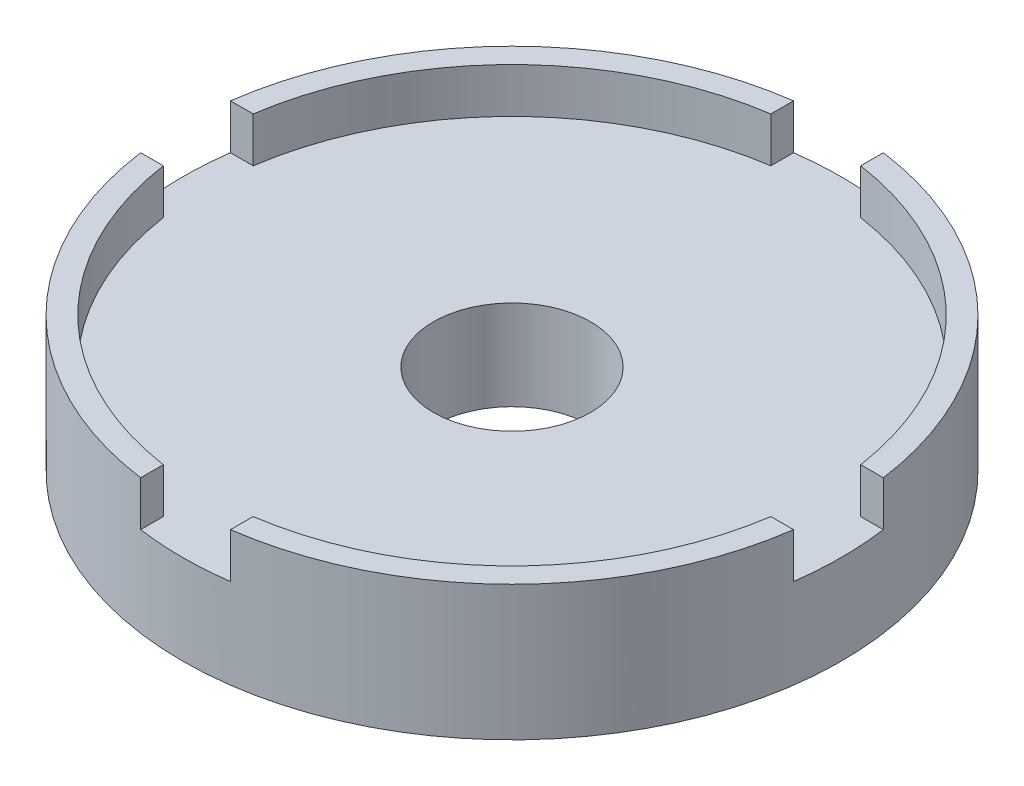
ISO-10303-21;
HEADER;
FILE_DESCRIPTION(('STEP AP214'),'2;1');
FILE_NAME('part.step','',(''),(''),'','','');
FILE_SCHEMA(('AUTOMOTIVE_DESIGN { 1 0 10303 214 1 1 1 1 }'));
ENDSEC;
DATA;
#1=APPLICATION_CONTEXT('core data for automotive mechanical design processes');
#2=APPLICATION_PROTOCOL_DEFINITION('international standard','automotive_design',2000,#1);
#3=PRODUCT_CONTEXT('',#1,'mechanical');
#4=PRODUCT('Part','Part','',(#3));
#5=PRODUCT_RELATED_PRODUCT_CATEGORY('part','',(#4));
#6=PRODUCT_DEFINITION_FORMATION('','',#4);
#7=PRODUCT_DEFINITION_CONTEXT('part definition',#1,'design');
#8=PRODUCT_DEFINITION('design','',#6,#7);
#9=PRODUCT_DEFINITION_SHAPE('','',#8);
#10=(LENGTH_UNIT() NAMED_UNIT(*) SI_UNIT(.MILLI.,.METRE.));
#11=(NAMED_UNIT(*) PLANE_ANGLE_UNIT() SI_UNIT($,.RADIAN.));
#12=(NAMED_UNIT(*) SI_UNIT($,.STERADIAN.) SOLID_ANGLE_UNIT());
#13=UNCERTAINTY_MEASURE_WITH_UNIT(LENGTH_MEASURE(1.E-05),#10,'distance_accuracy_value','');
#14=(GEOMETRIC_REPRESENTATION_CONTEXT(3) GLOBAL_UNCERTAINTY_ASSIGNED_CONTEXT((#13)) GLOBAL_UNIT_ASSIGNED_CONTEXT((#10,
#11,#12)) REPRESENTATION_CONTEXT('',''));
#15=CARTESIAN_POINT('',(0.,0.,0.));
#16=DIRECTION('',(0.,0.,1.));
#17=DIRECTION('',(1.,0.,0.));
#18=AXIS2_PLACEMENT_3D('',#15,#16,#17);
#19=CARTESIAN_POINT('',(4.00228236262587,0.,4.81806655713623));
#20=DIRECTION('',(0.,1.,0.));
#21=DIRECTION('',(0.,0.,1.));
#22=AXIS2_PLACEMENT_3D('',#19,#20,#21);
#23=CYLINDRICAL_SURFACE('',#22,68.353999999999);
#24=CARTESIAN_POINT('',(4.00228236262587,30.,4.81806655713623));
#25=DIRECTION('',(0.,1.,0.));
#26=DIRECTION('',(0.,0.,1.));
#27=AXIS2_PLACEMENT_3D('',#24,#25,#26);
#28=CIRCLE('',#27,68.353999999999);
#29=CARTESIAN_POINT('',(71.6208398450201,30.,-5.18193344286378));
#30=VERTEX_POINT('',#29);
#31=CARTESIAN_POINT('',(14.0022823626258,30.,-62.8004909252581));
#32=VERTEX_POINT('',#31);
#33=EDGE_CURVE('E201',#30,#32,#28,.T.);
#34=ORIENTED_EDGE('',*,*,#33,.T.);
#35=DIRECTION('',(0.,1.,0.));
#36=VECTOR('',#35,1.);
#37=CARTESIAN_POINT('',(14.0022823626258,0.,-62.8004909252581));
#38=LINE('',#37,#36);
#39=CARTESIAN_POINT('',(14.0022823626258,20.,-62.8004909252581));
#40=VERTEX_POINT('',#39);
#41=EDGE_CURVE('E232',#32,#40,#38,.F.);
#42=ORIENTED_EDGE('',*,*,#41,.T.);
#43=CARTESIAN_POINT('',(4.00228236262587,20.,4.81806655713623));
#44=DIRECTION('',(0.,1.,0.));
#45=DIRECTION('',(0.,0.,1.));
#46=AXIS2_PLACEMENT_3D('',#43,#44,#45);
#47=CIRCLE('',#46,68.353999999999);
#48=CARTESIAN_POINT('',(71.6208398450201,20.,-5.18193344286378));
#49=VERTEX_POINT('',#48);
#50=EDGE_CURVE('E172',#49,#40,#47,.T.);
#51=ORIENTED_EDGE('',*,*,#50,.F.);
#52=DIRECTION('',(0.,1.,0.));
#53=VECTOR('',#52,1.);
#54=CARTESIAN_POINT('',(71.6208398450201,0.,-5.18193344286378));
#55=LINE('',#54,#53);
#56=EDGE_CURVE('E210',#49,#30,#55,.T.);
#57=ORIENTED_EDGE('',*,*,#56,.T.);
#58=EDGE_LOOP('',(#34,#42,#51,#57));
#59=FACE_BOUND('',#58,.T.);
#60=ADVANCED_FACE('F35',(#59),#23,.F.);
#61=CARTESIAN_POINT('',(4.00228236262587,30.,4.81806655713623));
#62=DIRECTION('',(0.,1.,0.));
#63=DIRECTION('',(0.,0.,1.));
#64=AXIS2_PLACEMENT_3D('',#61,#62,#63);
#65=PLANE('',#64);
#66=DIRECTION('',(0.,0.,1.));
#67=VECTOR('',#66,1.);
#68=CARTESIAN_POINT('',(14.0022823626258,30.,-68.5359334428627));
#69=LINE('',#68,#67);
#70=CARTESIAN_POINT('',(14.0022823626258,30.,-67.8511106502593));
#71=VERTEX_POINT('',#70);
#72=EDGE_CURVE('E245',#71,#32,#69,.T.);
#73=ORIENTED_EDGE('',*,*,#72,.T.);
#74=ORIENTED_EDGE('',*,*,#33,.F.);
#75=DIRECTION('',(-1.,0.,0.));
#76=VECTOR('',#75,1.);
#77=CARTESIAN_POINT('',(4.00228236262587,30.,-5.18193344286378));
#78=LINE('',#77,#76);
#79=CARTESIAN_POINT('',(76.6714595700213,30.,-5.18193344286378));
#80=VERTEX_POINT('',#79);
#81=EDGE_CURVE('E271',#80,#30,#78,.T.);
#82=ORIENTED_EDGE('',*,*,#81,.F.);
#83=CARTESIAN_POINT('',(4.00228236262587,30.,4.81806655713623));
#84=DIRECTION('',(0.,1.,0.));
#85=DIRECTION('',(0.,0.,1.));
#86=AXIS2_PLACEMENT_3D('',#83,#84,#85);
#87=CIRCLE('',#86,73.353999999999);
#88=EDGE_CURVE('E186',#80,#71,#87,.T.);
#89=ORIENTED_EDGE('',*,*,#88,.T.);
#90=EDGE_LOOP('',(#73,#74,#82,#89));
#91=FACE_BOUND('',#90,.T.);
#92=ADVANCED_FACE('F270',(#91),#65,.T.);
#93=CARTESIAN_POINT('',(14.0022823626258,20.,72.4366240395305));
#94=VERTEX_POINT('',#93);
#95=CARTESIAN_POINT('',(71.6208398450201,20.,14.8180665571362));
#96=VERTEX_POINT('',#95);
#97=EDGE_CURVE('E175',#94,#96,#47,.T.);
#98=ORIENTED_EDGE('',*,*,#97,.F.);
#99=DIRECTION('',(0.,1.,0.));
#100=VECTOR('',#99,1.);
#101=CARTESIAN_POINT('',(14.0022823626258,0.,72.4366240395305));
#102=LINE('',#101,#100);
#103=CARTESIAN_POINT('',(14.0022823626258,30.,72.4366240395305));
#104=VERTEX_POINT('',#103);
#105=EDGE_CURVE('E157',#94,#104,#102,.T.);
#106=ORIENTED_EDGE('',*,*,#105,.T.);
#107=CARTESIAN_POINT('',(71.6208398450201,30.,14.8180665571362));
#108=VERTEX_POINT('',#107);
#109=EDGE_CURVE('E200',#104,#108,#28,.T.);
#110=ORIENTED_EDGE('',*,*,#109,.T.);
#111=DIRECTION('',(0.,1.,0.));
#112=VECTOR('',#111,1.);
#113=CARTESIAN_POINT('',(71.6208398450201,0.,14.8180665571362));
#114=LINE('',#113,#112);
#115=EDGE_CURVE('E217',#108,#96,#114,.F.);
#116=ORIENTED_EDGE('',*,*,#115,.T.);
#117=EDGE_LOOP('',(#98,#106,#110,#116));
#118=FACE_BOUND('',#117,.T.);
#119=ADVANCED_FACE('F302',(#118),#23,.F.);
#120=DIRECTION('',(0.,0.,-1.));
#121=VECTOR('',#120,1.);
#122=CARTESIAN_POINT('',(14.0022823626258,30.,4.81806655713623));
#123=LINE('',#122,#121);
#124=CARTESIAN_POINT('',(14.0022823626258,30.,77.4872437645317));
#125=VERTEX_POINT('',#124);
#126=EDGE_CURVE('E11',#125,#104,#123,.T.);
#127=ORIENTED_EDGE('',*,*,#126,.F.);
#128=CARTESIAN_POINT('',(76.6714595700213,30.,14.8180665571362));
#129=VERTEX_POINT('',#128);
#130=EDGE_CURVE('E193',#125,#129,#87,.T.);
#131=ORIENTED_EDGE('',*,*,#130,.T.);
#132=DIRECTION('',(1.,0.,0.));
#133=VECTOR('',#132,1.);
#134=CARTESIAN_POINT('',(4.00228236262587,30.,14.8180665571362));
#135=LINE('',#134,#133);
#136=EDGE_CURVE('E277',#108,#129,#135,.T.);
#137=ORIENTED_EDGE('',*,*,#136,.F.);
#138=ORIENTED_EDGE('',*,*,#109,.F.);
#139=EDGE_LOOP('',(#127,#131,#137,#138));
#140=FACE_BOUND('',#139,.T.);
#141=ADVANCED_FACE('F298',(#140),#65,.T.);
#142=CARTESIAN_POINT('',(-5.99771763737416,20.,-62.800490925258));
#143=VERTEX_POINT('',#142);
#144=CARTESIAN_POINT('',(-63.6162751197684,20.,-5.18193344286378));
#145=VERTEX_POINT('',#144);
#146=EDGE_CURVE('E163',#143,#145,#47,.T.);
#147=ORIENTED_EDGE('',*,*,#146,.F.);
#148=DIRECTION('',(0.,1.,0.));
#149=VECTOR('',#148,1.);
#150=CARTESIAN_POINT('',(-5.99771763737416,0.,-62.800490925258));
#151=LINE('',#150,#149);
#152=CARTESIAN_POINT('',(-5.99771763737417,30.,-62.800490925258));
#153=VERTEX_POINT('',#152);
#154=EDGE_CURVE('E148',#143,#153,#151,.T.);
#155=ORIENTED_EDGE('',*,*,#154,.T.);
#156=CARTESIAN_POINT('',(-63.6162751197684,30.,-5.18193344286378));
#157=VERTEX_POINT('',#156);
#158=EDGE_CURVE('E199',#153,#157,#28,.T.);
#159=ORIENTED_EDGE('',*,*,#158,.T.);
#160=DIRECTION('',(0.,1.,0.));
#161=VECTOR('',#160,1.);
#162=CARTESIAN_POINT('',(-63.6162751197684,0.,-5.18193344286378));
#163=LINE('',#162,#161);
#164=EDGE_CURVE('E171',#157,#145,#163,.F.);
#165=ORIENTED_EDGE('',*,*,#164,.T.);
#166=EDGE_LOOP('',(#147,#155,#159,#165));
#167=FACE_BOUND('',#166,.T.);
#168=ADVANCED_FACE('F169',(#167),#23,.F.);
#169=DIRECTION('',(0.,0.,1.));
#170=VECTOR('',#169,1.);
#171=CARTESIAN_POINT('',(-5.99771763737417,30.,-68.5359334428627));
#172=LINE('',#171,#170);
#173=CARTESIAN_POINT('',(-5.99771763737417,30.,-67.8511106502593));
#174=VERTEX_POINT('',#173);
#175=EDGE_CURVE('E153',#174,#153,#172,.T.);
#176=ORIENTED_EDGE('',*,*,#175,.F.);
#177=CARTESIAN_POINT('',(-68.6668948447696,30.,-5.18193344286378));
#178=VERTEX_POINT('',#177);
#179=EDGE_CURVE('E190',#174,#178,#87,.T.);
#180=ORIENTED_EDGE('',*,*,#179,.T.);
#181=EDGE_CURVE('E272',#157,#178,#78,.T.);
#182=ORIENTED_EDGE('',*,*,#181,.F.);
#183=ORIENTED_EDGE('',*,*,#158,.F.);
#184=EDGE_LOOP('',(#176,#180,#182,#183));
#185=FACE_BOUND('',#184,.T.);
#186=ADVANCED_FACE('F289',(#185),#65,.T.);
#187=CARTESIAN_POINT('',(4.00228236262587,20.,4.81806655713623));
#188=DIRECTION('',(0.,1.,0.));
#189=DIRECTION('',(0.,0.,1.));
#190=AXIS2_PLACEMENT_3D('',#187,#188,#189);
#191=PLANE('',#190);
#192=CARTESIAN_POINT('',(4.00228236262587,20.,4.81806655713623));
#193=DIRECTION('',(0.,1.,0.));
#194=DIRECTION('',(0.,0.,1.));
#195=AXIS2_PLACEMENT_3D('',#192,#193,#194);
#196=CIRCLE('',#195,17.5);
#197=CARTESIAN_POINT('',(4.00228236262587,20.,22.3180665571362));
#198=VERTEX_POINT('',#197);
#199=EDGE_CURVE('E280',#198,#198,#196,.T.);
#200=ORIENTED_EDGE('',*,*,#199,.F.);
#201=EDGE_LOOP('',(#200));
#202=FACE_BOUND('',#201,.T.);
#203=DIRECTION('',(0.,0.,1.));
#204=VECTOR('',#203,1.);
#205=CARTESIAN_POINT('',(14.0022823626258,20.,-68.5359334428627));
#206=LINE('',#205,#204);
#207=CARTESIAN_POINT('',(14.0022823626258,20.,77.4872437645317));
#208=VERTEX_POINT('',#207);
#209=EDGE_CURVE('E165',#94,#208,#206,.T.);
#210=ORIENTED_EDGE('',*,*,#209,.F.);
#211=ORIENTED_EDGE('',*,*,#97,.T.);
#212=DIRECTION('',(1.,0.,0.));
#213=VECTOR('',#212,1.);
#214=CARTESIAN_POINT('',(-69.3517176373731,20.,14.8180665571362));
#215=LINE('',#214,#213);
#216=CARTESIAN_POINT('',(76.6714595700213,20.,14.8180665571362));
#217=VERTEX_POINT('',#216);
#218=EDGE_CURVE('E224',#96,#217,#215,.T.);
#219=ORIENTED_EDGE('',*,*,#218,.T.);
#220=CARTESIAN_POINT('',(4.00228236262587,20.,4.81806655713623));
#221=DIRECTION('',(0.,-1.,0.));
#222=DIRECTION('',(0.,0.,-1.));
#223=AXIS2_PLACEMENT_3D('',#220,#221,#222);
#224=CIRCLE('',#223,73.353999999999);
#225=CARTESIAN_POINT('',(76.6714595700213,20.,-5.18193344286378));
#226=VERTEX_POINT('',#225);
#227=EDGE_CURVE('E204',#217,#226,#224,.F.);
#228=ORIENTED_EDGE('',*,*,#227,.T.);
#229=DIRECTION('',(1.,0.,0.));
#230=VECTOR('',#229,1.);
#231=CARTESIAN_POINT('',(-69.3517176373731,20.,-5.18193344286378));
#232=LINE('',#231,#230);
#233=EDGE_CURVE('E227',#49,#226,#232,.T.);
#234=ORIENTED_EDGE('',*,*,#233,.F.);
#235=ORIENTED_EDGE('',*,*,#50,.T.);
#236=CARTESIAN_POINT('',(14.0022823626258,20.,-67.8511106502593));
#237=VERTEX_POINT('',#236);
#238=EDGE_CURVE('E250',#237,#40,#206,.T.);
#239=ORIENTED_EDGE('',*,*,#238,.F.);
#240=CARTESIAN_POINT('',(4.00228236262587,20.,4.81806655713623));
#241=DIRECTION('',(0.,-1.,0.));
#242=DIRECTION('',(1.,0.,0.));
#243=AXIS2_PLACEMENT_3D('',#240,#241,#242);
#244=CIRCLE('',#243,73.353999999999);
#245=CARTESIAN_POINT('',(-5.99771763737416,20.,-67.8511106502593));
#246=VERTEX_POINT('',#245);
#247=EDGE_CURVE('E50',#237,#246,#244,.F.);
#248=ORIENTED_EDGE('',*,*,#247,.T.);
#249=DIRECTION('',(0.,0.,1.));
#250=VECTOR('',#249,1.);
#251=CARTESIAN_POINT('',(-5.99771763737416,20.,-68.5359334428627));
#252=LINE('',#251,#250);
#253=EDGE_CURVE('E150',#246,#143,#252,.T.);
#254=ORIENTED_EDGE('',*,*,#253,.T.);
#255=ORIENTED_EDGE('',*,*,#146,.T.);
#256=CARTESIAN_POINT('',(-68.6668948447696,20.,-5.18193344286378));
#257=VERTEX_POINT('',#256);
#258=EDGE_CURVE('E223',#257,#145,#232,.T.);
#259=ORIENTED_EDGE('',*,*,#258,.F.);
#260=CARTESIAN_POINT('',(-68.6668948447696,20.,14.8180665571362));
#261=VERTEX_POINT('',#260);
#262=EDGE_CURVE('E202',#257,#261,#224,.F.);
#263=ORIENTED_EDGE('',*,*,#262,.T.);
#264=CARTESIAN_POINT('',(-63.6162751197684,20.,14.8180665571362));
#265=VERTEX_POINT('',#264);
#266=EDGE_CURVE('E226',#261,#265,#215,.T.);
#267=ORIENTED_EDGE('',*,*,#266,.T.);
#268=CARTESIAN_POINT('',(-5.99771763737416,20.,72.4366240395305));
#269=VERTEX_POINT('',#268);
#270=EDGE_CURVE('E173',#265,#269,#47,.T.);
#271=ORIENTED_EDGE('',*,*,#270,.T.);
#272=CARTESIAN_POINT('',(-5.99771763737416,20.,77.4872437645317));
#273=VERTEX_POINT('',#272);
#274=EDGE_CURVE('E166',#269,#273,#252,.T.);
#275=ORIENTED_EDGE('',*,*,#274,.T.);
#276=EDGE_CURVE('E231',#273,#208,#244,.F.);
#277=ORIENTED_EDGE('',*,*,#276,.T.);
#278=EDGE_LOOP('',(#210,#211,#219,#228,#234,#235,#239,#248,#254,#255,#259,#263,#267,#271,#275,#277));
#279=FACE_BOUND('',#278,.T.);
#280=ADVANCED_FACE('F161',(#202,#279),#191,.T.);
#281=CARTESIAN_POINT('',(4.00228236262587,0.,4.81806655713623));
#282=DIRECTION('',(0.,1.,0.));
#283=DIRECTION('',(0.,0.,1.));
#284=AXIS2_PLACEMENT_3D('',#281,#282,#283);
#285=PLANE('',#284);
#286=CARTESIAN_POINT('',(4.00228236262587,0.,4.81806655713623));
#287=DIRECTION('',(0.,1.,0.));
#288=DIRECTION('',(0.,0.,1.));
#289=AXIS2_PLACEMENT_3D('',#286,#287,#288);
#290=CIRCLE('',#289,17.5);
#291=CARTESIAN_POINT('',(4.00228236262587,0.,22.3180665571362));
#292=VERTEX_POINT('',#291);
#293=EDGE_CURVE('E177',#292,#292,#290,.T.);
#294=ORIENTED_EDGE('',*,*,#293,.T.);
#295=EDGE_LOOP('',(#294));
#296=FACE_BOUND('',#295,.T.);
#297=CARTESIAN_POINT('',(4.00228236262587,0.,4.81806655713623));
#298=DIRECTION('',(0.,1.,0.));
#299=DIRECTION('',(0.,0.,1.));
#300=AXIS2_PLACEMENT_3D('',#297,#298,#299);
#301=CIRCLE('',#300,73.353999999999);
#302=CARTESIAN_POINT('',(4.00228236262587,0.,78.1720665571352));
#303=VERTEX_POINT('',#302);
#304=EDGE_CURVE('E181',#303,#303,#301,.T.);
#305=ORIENTED_EDGE('',*,*,#304,.F.);
#306=EDGE_LOOP('',(#305));
#307=FACE_BOUND('',#306,.T.);
#308=ADVANCED_FACE('F37',(#296,#307),#285,.F.);
#309=CARTESIAN_POINT('',(4.00228236262587,20.,4.81806655713623));
#310=DIRECTION('',(0.,-1.,0.));
#311=DIRECTION('',(0.,0.,-1.));
#312=AXIS2_PLACEMENT_3D('',#309,#310,#311);
#313=CYLINDRICAL_SURFACE('',#312,17.5);
#314=ORIENTED_EDGE('',*,*,#199,.T.);
#315=EDGE_LOOP('',(#314));
#316=FACE_BOUND('',#315,.T.);
#317=ORIENTED_EDGE('',*,*,#293,.F.);
#318=EDGE_LOOP('',(#317));
#319=FACE_BOUND('',#318,.T.);
#320=ADVANCED_FACE('F285',(#316,#319),#313,.F.);
#321=CARTESIAN_POINT('',(4.00228236262587,0.,4.81806655713623));
#322=DIRECTION('',(0.,1.,0.));
#323=DIRECTION('',(0.,0.,1.));
#324=AXIS2_PLACEMENT_3D('',#321,#322,#323);
#325=CYLINDRICAL_SURFACE('',#324,73.353999999999);
#326=DIRECTION('',(0.,1.,0.));
#327=VECTOR('',#326,1.);
#328=CARTESIAN_POINT('',(14.0022823626258,0.,-67.8511106502593));
#329=LINE('',#328,#327);
#330=EDGE_CURVE('E235',#71,#237,#329,.F.);
#331=ORIENTED_EDGE('',*,*,#330,.F.);
#332=ORIENTED_EDGE('',*,*,#88,.F.);
#333=DIRECTION('',(0.,1.,0.));
#334=VECTOR('',#333,1.);
#335=CARTESIAN_POINT('',(76.6714595700213,0.,-5.18193344286378));
#336=LINE('',#335,#334);
#337=EDGE_CURVE('E207',#226,#80,#336,.T.);
#338=ORIENTED_EDGE('',*,*,#337,.F.);
#339=ORIENTED_EDGE('',*,*,#227,.F.);
#340=DIRECTION('',(0.,1.,0.));
#341=VECTOR('',#340,1.);
#342=CARTESIAN_POINT('',(76.6714595700213,0.,14.8180665571362));
#343=LINE('',#342,#341);
#344=EDGE_CURVE('E213',#129,#217,#343,.F.);
#345=ORIENTED_EDGE('',*,*,#344,.F.);
#346=ORIENTED_EDGE('',*,*,#130,.F.);
#347=DIRECTION('',(0.,1.,0.));
#348=VECTOR('',#347,1.);
#349=CARTESIAN_POINT('',(14.0022823626258,0.,77.4872437645317));
#350=LINE('',#349,#348);
#351=EDGE_CURVE('E237',#208,#125,#350,.T.);
#352=ORIENTED_EDGE('',*,*,#351,.F.);
#353=ORIENTED_EDGE('',*,*,#276,.F.);
#354=DIRECTION('',(0.,1.,0.));
#355=VECTOR('',#354,1.);
#356=CARTESIAN_POINT('',(-5.99771763737416,0.,77.4872437645317));
#357=LINE('',#356,#355);
#358=CARTESIAN_POINT('',(-5.99771763737417,30.,77.4872437645317));
#359=VERTEX_POINT('',#358);
#360=EDGE_CURVE('E158',#359,#273,#357,.F.);
#361=ORIENTED_EDGE('',*,*,#360,.F.);
#362=CARTESIAN_POINT('',(-68.6668948447696,30.,14.8180665571362));
#363=VERTEX_POINT('',#362);
#364=EDGE_CURVE('E192',#363,#359,#87,.T.);
#365=ORIENTED_EDGE('',*,*,#364,.F.);
#366=DIRECTION('',(0.,1.,0.));
#367=VECTOR('',#366,1.);
#368=CARTESIAN_POINT('',(-68.6668948447696,0.,14.8180665571362));
#369=LINE('',#368,#367);
#370=EDGE_CURVE('E215',#261,#363,#369,.T.);
#371=ORIENTED_EDGE('',*,*,#370,.F.);
#372=ORIENTED_EDGE('',*,*,#262,.F.);
#373=DIRECTION('',(0.,1.,0.));
#374=VECTOR('',#373,1.);
#375=CARTESIAN_POINT('',(-68.6668948447696,0.,-5.18193344286378));
#376=LINE('',#375,#374);
#377=EDGE_CURVE('E205',#178,#257,#376,.F.);
#378=ORIENTED_EDGE('',*,*,#377,.F.);
#379=ORIENTED_EDGE('',*,*,#179,.F.);
#380=DIRECTION('',(0.,1.,0.));
#381=VECTOR('',#380,1.);
#382=CARTESIAN_POINT('',(-5.99771763737416,0.,-67.8511106502593));
#383=LINE('',#382,#381);
#384=EDGE_CURVE('E242',#246,#174,#383,.T.);
#385=ORIENTED_EDGE('',*,*,#384,.F.);
#386=ORIENTED_EDGE('',*,*,#247,.F.);
#387=EDGE_LOOP('',(#331,#332,#338,#339,#345,#346,#352,#353,#361,#365,#371,#372,#378,#379,#385,#386));
#388=FACE_BOUND('',#387,.T.);
#389=ORIENTED_EDGE('',*,*,#304,.T.);
#390=EDGE_LOOP('',(#389));
#391=FACE_BOUND('',#390,.T.);
#392=ADVANCED_FACE('F268',(#388,#391),#325,.T.);
#393=CARTESIAN_POINT('',(-63.6162751197684,30.,14.8180665571362));
#394=VERTEX_POINT('',#393);
#395=CARTESIAN_POINT('',(-5.99771763737417,30.,72.4366240395305));
#396=VERTEX_POINT('',#395);
#397=EDGE_CURVE('E196',#394,#396,#28,.T.);
#398=ORIENTED_EDGE('',*,*,#397,.T.);
#399=DIRECTION('',(0.,1.,0.));
#400=VECTOR('',#399,1.);
#401=CARTESIAN_POINT('',(-5.99771763737416,0.,72.4366240395305));
#402=LINE('',#401,#400);
#403=EDGE_CURVE('E58',#396,#269,#402,.F.);
#404=ORIENTED_EDGE('',*,*,#403,.T.);
#405=ORIENTED_EDGE('',*,*,#270,.F.);
#406=DIRECTION('',(0.,1.,0.));
#407=VECTOR('',#406,1.);
#408=CARTESIAN_POINT('',(-63.6162751197684,0.,14.8180665571362));
#409=LINE('',#408,#407);
#410=EDGE_CURVE('E220',#265,#394,#409,.T.);
#411=ORIENTED_EDGE('',*,*,#410,.T.);
#412=EDGE_LOOP('',(#398,#404,#405,#411));
#413=FACE_BOUND('',#412,.T.);
#414=ADVANCED_FACE('F303',(#413),#23,.F.);
#415=DIRECTION('',(0.,0.,1.));
#416=VECTOR('',#415,1.);
#417=CARTESIAN_POINT('',(-5.99771763737417,30.,4.81806655713623));
#418=LINE('',#417,#416);
#419=EDGE_CURVE('E43',#396,#359,#418,.T.);
#420=ORIENTED_EDGE('',*,*,#419,.F.);
#421=ORIENTED_EDGE('',*,*,#397,.F.);
#422=EDGE_CURVE('E275',#363,#394,#135,.T.);
#423=ORIENTED_EDGE('',*,*,#422,.F.);
#424=ORIENTED_EDGE('',*,*,#364,.T.);
#425=EDGE_LOOP('',(#420,#421,#423,#424));
#426=FACE_BOUND('',#425,.T.);
#427=ADVANCED_FACE('F297',(#426),#65,.T.);
#428=CARTESIAN_POINT('',(-69.3517176373731,30.,-5.18193344286378));
#429=DIRECTION('',(0.,0.,-1.));
#430=DIRECTION('',(0.,1.,0.));
#431=AXIS2_PLACEMENT_3D('',#428,#429,#430);
#432=PLANE('',#431);
#433=ORIENTED_EDGE('',*,*,#337,.T.);
#434=ORIENTED_EDGE('',*,*,#81,.T.);
#435=ORIENTED_EDGE('',*,*,#56,.F.);
#436=ORIENTED_EDGE('',*,*,#233,.T.);
#437=EDGE_LOOP('',(#433,#434,#435,#436));
#438=FACE_BOUND('',#437,.T.);
#439=ADVANCED_FACE('F264',(#438),#432,.F.);
#440=CARTESIAN_POINT('',(-69.3517176373731,20.,14.8180665571362));
#441=DIRECTION('',(0.,0.,1.));
#442=DIRECTION('',(0.,-1.,0.));
#443=AXIS2_PLACEMENT_3D('',#440,#441,#442);
#444=PLANE('',#443);
#445=ORIENTED_EDGE('',*,*,#344,.T.);
#446=ORIENTED_EDGE('',*,*,#218,.F.);
#447=ORIENTED_EDGE('',*,*,#115,.F.);
#448=ORIENTED_EDGE('',*,*,#136,.T.);
#449=EDGE_LOOP('',(#445,#446,#447,#448));
#450=FACE_BOUND('',#449,.T.);
#451=ADVANCED_FACE('F326',(#450),#444,.F.);
#452=ORIENTED_EDGE('',*,*,#377,.T.);
#453=ORIENTED_EDGE('',*,*,#258,.T.);
#454=ORIENTED_EDGE('',*,*,#164,.F.);
#455=ORIENTED_EDGE('',*,*,#181,.T.);
#456=EDGE_LOOP('',(#452,#453,#454,#455));
#457=FACE_BOUND('',#456,.T.);
#458=ADVANCED_FACE('F329',(#457),#432,.F.);
#459=ORIENTED_EDGE('',*,*,#370,.T.);
#460=ORIENTED_EDGE('',*,*,#422,.T.);
#461=ORIENTED_EDGE('',*,*,#410,.F.);
#462=ORIENTED_EDGE('',*,*,#266,.F.);
#463=EDGE_LOOP('',(#459,#460,#461,#462));
#464=FACE_BOUND('',#463,.T.);
#465=ADVANCED_FACE('F331',(#464),#444,.F.);
#466=CARTESIAN_POINT('',(14.0022823626258,30.,-68.5359334428627));
#467=DIRECTION('',(1.,0.,0.));
#468=DIRECTION('',(0.,1.,0.));
#469=AXIS2_PLACEMENT_3D('',#466,#467,#468);
#470=PLANE('',#469);
#471=ORIENTED_EDGE('',*,*,#351,.T.);
#472=ORIENTED_EDGE('',*,*,#126,.T.);
#473=ORIENTED_EDGE('',*,*,#105,.F.);
#474=ORIENTED_EDGE('',*,*,#209,.T.);
#475=EDGE_LOOP('',(#471,#472,#473,#474));
#476=FACE_BOUND('',#475,.T.);
#477=ADVANCED_FACE('F339',(#476),#470,.F.);
#478=CARTESIAN_POINT('',(-5.99771763737416,20.,-68.5359334428627));
#479=DIRECTION('',(-1.,0.,0.));
#480=DIRECTION('',(0.,-1.,0.));
#481=AXIS2_PLACEMENT_3D('',#478,#479,#480);
#482=PLANE('',#481);
#483=ORIENTED_EDGE('',*,*,#360,.T.);
#484=ORIENTED_EDGE('',*,*,#274,.F.);
#485=ORIENTED_EDGE('',*,*,#403,.F.);
#486=ORIENTED_EDGE('',*,*,#419,.T.);
#487=EDGE_LOOP('',(#483,#484,#485,#486));
#488=FACE_BOUND('',#487,.T.);
#489=ADVANCED_FACE('F337',(#488),#482,.F.);
#490=ORIENTED_EDGE('',*,*,#72,.F.);
#491=ORIENTED_EDGE('',*,*,#330,.T.);
#492=ORIENTED_EDGE('',*,*,#238,.T.);
#493=ORIENTED_EDGE('',*,*,#41,.F.);
#494=EDGE_LOOP('',(#490,#491,#492,#493));
#495=FACE_BOUND('',#494,.T.);
#496=ADVANCED_FACE('F256',(#495),#470,.F.);
#497=ORIENTED_EDGE('',*,*,#253,.F.);
#498=ORIENTED_EDGE('',*,*,#384,.T.);
#499=ORIENTED_EDGE('',*,*,#175,.T.);
#500=ORIENTED_EDGE('',*,*,#154,.F.);
#501=EDGE_LOOP('',(#497,#498,#499,#500));
#502=FACE_BOUND('',#501,.T.);
#503=ADVANCED_FACE('F149',(#502),#482,.F.);
#504=CLOSED_SHELL('',(#60,#92,#119,#141,#168,#186,#280,#308,#320,#392,#414,#427,#439,#451,#458,
#465,#477,#489,#496,#503));
#505=MANIFOLD_SOLID_BREP('B2',#504);
#506=ADVANCED_BREP_SHAPE_REPRESENTATION('',(#18,#505),#14);
#507=SHAPE_DEFINITION_REPRESENTATION(#9,#506);
ENDSEC;
END-ISO-10303-21;
